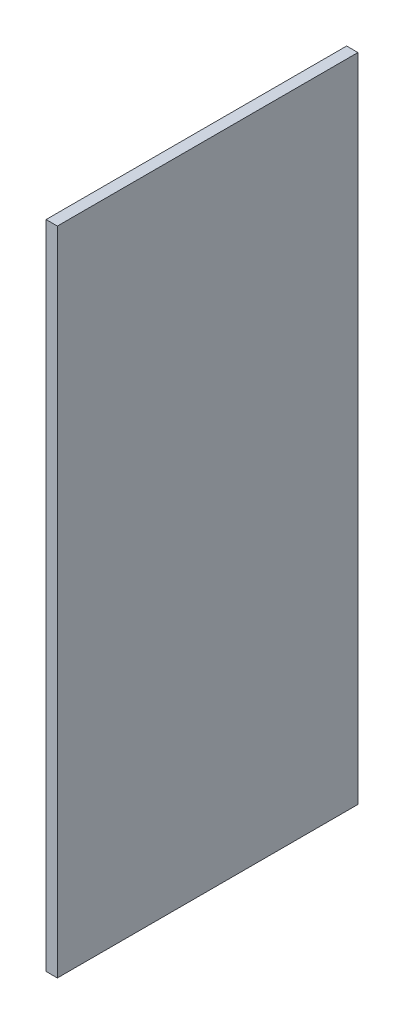
ISO-10303-21;
HEADER;
FILE_DESCRIPTION(('STEP AP214'),'2;1');
FILE_NAME('part.step','',(''),(''),'','','');
FILE_SCHEMA(('AUTOMOTIVE_DESIGN { 1 0 10303 214 1 1 1 1 }'));
ENDSEC;
DATA;
#1=APPLICATION_CONTEXT('core data for automotive mechanical design processes');
#2=APPLICATION_PROTOCOL_DEFINITION('international standard','automotive_design',2000,#1);
#3=PRODUCT_CONTEXT('',#1,'mechanical');
#4=PRODUCT('Part','Part','',(#3));
#5=PRODUCT_RELATED_PRODUCT_CATEGORY('part','',(#4));
#6=PRODUCT_DEFINITION_FORMATION('','',#4);
#7=PRODUCT_DEFINITION_CONTEXT('part definition',#1,'design');
#8=PRODUCT_DEFINITION('design','',#6,#7);
#9=PRODUCT_DEFINITION_SHAPE('','',#8);
#10=(LENGTH_UNIT() NAMED_UNIT(*) SI_UNIT(.MILLI.,.METRE.));
#11=(NAMED_UNIT(*) PLANE_ANGLE_UNIT() SI_UNIT($,.RADIAN.));
#12=(NAMED_UNIT(*) SI_UNIT($,.STERADIAN.) SOLID_ANGLE_UNIT());
#13=UNCERTAINTY_MEASURE_WITH_UNIT(LENGTH_MEASURE(1.E-05),#10,'distance_accuracy_value','');
#14=(GEOMETRIC_REPRESENTATION_CONTEXT(3) GLOBAL_UNCERTAINTY_ASSIGNED_CONTEXT((#13)) GLOBAL_UNIT_ASSIGNED_CONTEXT((#10,
#11,#12)) REPRESENTATION_CONTEXT('',''));
#15=CARTESIAN_POINT('',(0.,0.,0.));
#16=DIRECTION('',(0.,0.,1.));
#17=DIRECTION('',(1.,0.,0.));
#18=AXIS2_PLACEMENT_3D('',#15,#16,#17);
#19=CARTESIAN_POINT('',(668.5,120.,-818.5));
#20=DIRECTION('',(-1.,0.,0.));
#21=DIRECTION('',(0.,0.,1.));
#22=AXIS2_PLACEMENT_3D('',#19,#20,#21);
#23=PLANE('',#22);
#24=DIRECTION('',(0.,-1.,0.));
#25=VECTOR('',#24,1.);
#26=CARTESIAN_POINT('',(668.5,120.,-20.));
#27=LINE('',#26,#25);
#28=CARTESIAN_POINT('',(668.5,1850.,-20.));
#29=VERTEX_POINT('',#28);
#30=CARTESIAN_POINT('',(668.5,120.,-20.));
#31=VERTEX_POINT('',#30);
#32=EDGE_CURVE('E103',#29,#31,#27,.T.);
#33=ORIENTED_EDGE('',*,*,#32,.F.);
#34=DIRECTION('',(0.,0.,1.));
#35=VECTOR('',#34,1.);
#36=CARTESIAN_POINT('',(668.5,1850.,-818.5));
#37=LINE('',#36,#35);
#38=CARTESIAN_POINT('',(668.5,1850.,-818.5));
#39=VERTEX_POINT('',#38);
#40=EDGE_CURVE('E11',#39,#29,#37,.T.);
#41=ORIENTED_EDGE('',*,*,#40,.F.);
#42=DIRECTION('',(0.,-1.,0.));
#43=VECTOR('',#42,1.);
#44=CARTESIAN_POINT('',(668.5,120.,-818.5));
#45=LINE('',#44,#43);
#46=CARTESIAN_POINT('',(668.5,120.,-818.5));
#47=VERTEX_POINT('',#46);
#48=EDGE_CURVE('E97',#39,#47,#45,.T.);
#49=ORIENTED_EDGE('',*,*,#48,.T.);
#50=DIRECTION('',(0.,0.,1.));
#51=VECTOR('',#50,1.);
#52=CARTESIAN_POINT('',(668.5,120.,-818.5));
#53=LINE('',#52,#51);
#54=EDGE_CURVE('E42',#47,#31,#53,.T.);
#55=ORIENTED_EDGE('',*,*,#54,.T.);
#56=EDGE_LOOP('',(#33,#41,#49,#55));
#57=FACE_BOUND('',#56,.T.);
#58=ADVANCED_FACE('F39',(#57),#23,.T.);
#59=CARTESIAN_POINT('',(668.5,1850.,-818.5));
#60=DIRECTION('',(0.,1.,0.));
#61=DIRECTION('',(0.,0.,1.));
#62=AXIS2_PLACEMENT_3D('',#59,#60,#61);
#63=PLANE('',#62);
#64=DIRECTION('',(-1.,0.,0.));
#65=VECTOR('',#64,1.);
#66=CARTESIAN_POINT('',(668.5,1850.,-20.));
#67=LINE('',#66,#65);
#68=CARTESIAN_POINT('',(698.5,1850.,-20.));
#69=VERTEX_POINT('',#68);
#70=EDGE_CURVE('E99',#69,#29,#67,.T.);
#71=ORIENTED_EDGE('',*,*,#70,.F.);
#72=DIRECTION('',(0.,0.,1.));
#73=VECTOR('',#72,1.);
#74=CARTESIAN_POINT('',(698.5,1850.,-818.5));
#75=LINE('',#74,#73);
#76=CARTESIAN_POINT('',(698.5,1850.,-818.5));
#77=VERTEX_POINT('',#76);
#78=EDGE_CURVE('E48',#77,#69,#75,.T.);
#79=ORIENTED_EDGE('',*,*,#78,.F.);
#80=DIRECTION('',(-1.,0.,0.));
#81=VECTOR('',#80,1.);
#82=CARTESIAN_POINT('',(668.5,1850.,-818.5));
#83=LINE('',#82,#81);
#84=EDGE_CURVE('E94',#77,#39,#83,.T.);
#85=ORIENTED_EDGE('',*,*,#84,.T.);
#86=ORIENTED_EDGE('',*,*,#40,.T.);
#87=EDGE_LOOP('',(#71,#79,#85,#86));
#88=FACE_BOUND('',#87,.T.);
#89=ADVANCED_FACE('F113',(#88),#63,.T.);
#90=CARTESIAN_POINT('',(698.5,120.,-818.5));
#91=DIRECTION('',(1.,0.,0.));
#92=DIRECTION('',(0.,0.,-1.));
#93=AXIS2_PLACEMENT_3D('',#90,#91,#92);
#94=PLANE('',#93);
#95=DIRECTION('',(0.,1.,0.));
#96=VECTOR('',#95,1.);
#97=CARTESIAN_POINT('',(698.5,120.,-20.));
#98=LINE('',#97,#96);
#99=CARTESIAN_POINT('',(698.5,120.,-20.));
#100=VERTEX_POINT('',#99);
#101=EDGE_CURVE('E89',#100,#69,#98,.T.);
#102=ORIENTED_EDGE('',*,*,#101,.F.);
#103=DIRECTION('',(0.,0.,1.));
#104=VECTOR('',#103,1.);
#105=CARTESIAN_POINT('',(698.5,120.,-818.5));
#106=LINE('',#105,#104);
#107=CARTESIAN_POINT('',(698.5,120.,-818.5));
#108=VERTEX_POINT('',#107);
#109=EDGE_CURVE('E84',#108,#100,#106,.T.);
#110=ORIENTED_EDGE('',*,*,#109,.F.);
#111=DIRECTION('',(0.,1.,0.));
#112=VECTOR('',#111,1.);
#113=CARTESIAN_POINT('',(698.5,120.,-818.5));
#114=LINE('',#113,#112);
#115=EDGE_CURVE('E87',#108,#77,#114,.T.);
#116=ORIENTED_EDGE('',*,*,#115,.T.);
#117=ORIENTED_EDGE('',*,*,#78,.T.);
#118=EDGE_LOOP('',(#102,#110,#116,#117));
#119=FACE_BOUND('',#118,.T.);
#120=ADVANCED_FACE('F86',(#119),#94,.T.);
#121=CARTESIAN_POINT('',(668.5,120.,-818.5));
#122=DIRECTION('',(0.,-1.,0.));
#123=DIRECTION('',(0.,0.,-1.));
#124=AXIS2_PLACEMENT_3D('',#121,#122,#123);
#125=PLANE('',#124);
#126=DIRECTION('',(1.,0.,0.));
#127=VECTOR('',#126,1.);
#128=CARTESIAN_POINT('',(668.5,120.,-20.));
#129=LINE('',#128,#127);
#130=EDGE_CURVE('E106',#31,#100,#129,.T.);
#131=ORIENTED_EDGE('',*,*,#130,.F.);
#132=ORIENTED_EDGE('',*,*,#54,.F.);
#133=DIRECTION('',(1.,0.,0.));
#134=VECTOR('',#133,1.);
#135=CARTESIAN_POINT('',(668.5,120.,-818.5));
#136=LINE('',#135,#134);
#137=EDGE_CURVE('E93',#47,#108,#136,.T.);
#138=ORIENTED_EDGE('',*,*,#137,.T.);
#139=ORIENTED_EDGE('',*,*,#109,.T.);
#140=EDGE_LOOP('',(#131,#132,#138,#139));
#141=FACE_BOUND('',#140,.T.);
#142=ADVANCED_FACE('F96',(#141),#125,.T.);
#143=CARTESIAN_POINT('',(0.,0.,-818.5));
#144=DIRECTION('',(0.,0.,-1.));
#145=DIRECTION('',(-1.,0.,0.));
#146=AXIS2_PLACEMENT_3D('',#143,#144,#145);
#147=PLANE('',#146);
#148=ORIENTED_EDGE('',*,*,#48,.F.);
#149=ORIENTED_EDGE('',*,*,#84,.F.);
#150=ORIENTED_EDGE('',*,*,#115,.F.);
#151=ORIENTED_EDGE('',*,*,#137,.F.);
#152=EDGE_LOOP('',(#148,#149,#150,#151));
#153=FACE_BOUND('',#152,.T.);
#154=ADVANCED_FACE('F92',(#153),#147,.T.);
#155=CARTESIAN_POINT('',(0.,0.,-20.));
#156=DIRECTION('',(0.,0.,-1.));
#157=DIRECTION('',(-1.,0.,0.));
#158=AXIS2_PLACEMENT_3D('',#155,#156,#157);
#159=PLANE('',#158);
#160=ORIENTED_EDGE('',*,*,#32,.T.);
#161=ORIENTED_EDGE('',*,*,#130,.T.);
#162=ORIENTED_EDGE('',*,*,#101,.T.);
#163=ORIENTED_EDGE('',*,*,#70,.T.);
#164=EDGE_LOOP('',(#160,#161,#162,#163));
#165=FACE_BOUND('',#164,.T.);
#166=ADVANCED_FACE('F112',(#165),#159,.F.);
#167=CLOSED_SHELL('',(#58,#89,#120,#142,#154,#166));
#168=MANIFOLD_SOLID_BREP('B2',#167);
#169=ADVANCED_BREP_SHAPE_REPRESENTATION('',(#18,#168),#14);
#170=SHAPE_DEFINITION_REPRESENTATION(#9,#169);
ENDSEC;
END-ISO-10303-21;
